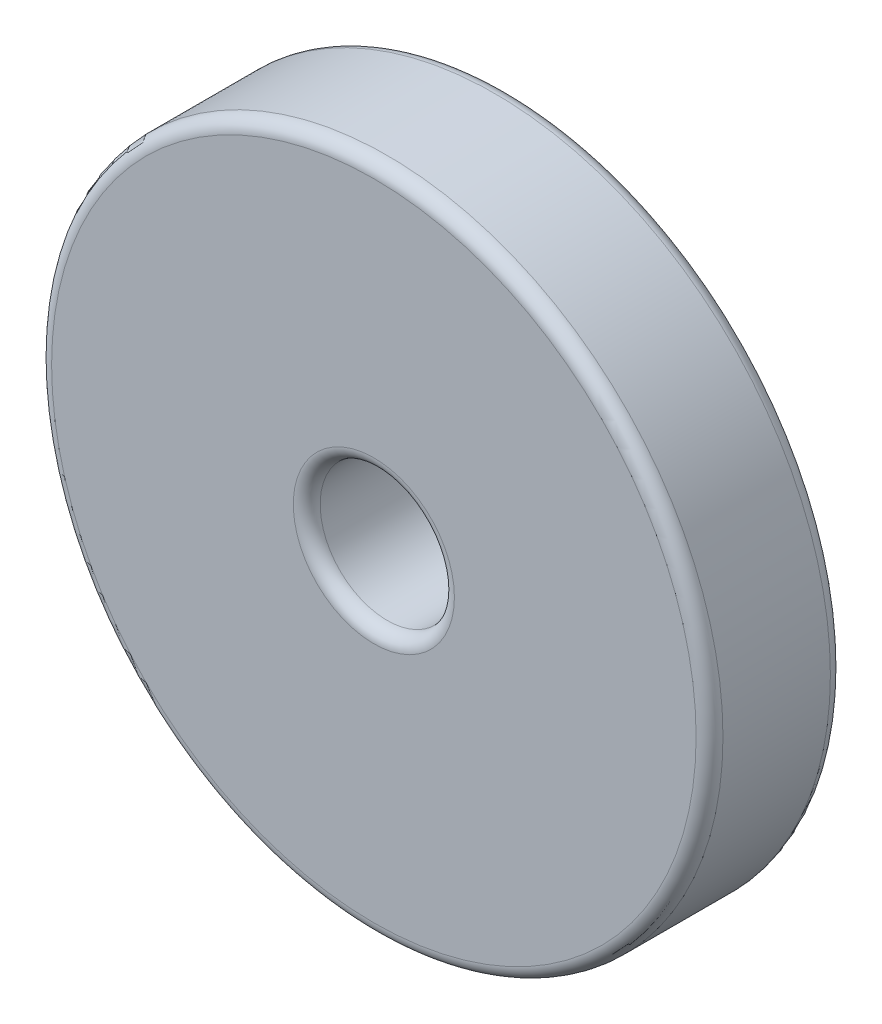
ISO-10303-21;
HEADER;
FILE_DESCRIPTION(('STEP AP214'),'2;1');
FILE_NAME('part.step','',(''),(''),'','','');
FILE_SCHEMA(('AUTOMOTIVE_DESIGN { 1 0 10303 214 1 1 1 1 }'));
ENDSEC;
DATA;
#1=APPLICATION_CONTEXT('core data for automotive mechanical design processes');
#2=APPLICATION_PROTOCOL_DEFINITION('international standard','automotive_design',2000,#1);
#3=PRODUCT_CONTEXT('',#1,'mechanical');
#4=PRODUCT('Part','Part','',(#3));
#5=PRODUCT_RELATED_PRODUCT_CATEGORY('part','',(#4));
#6=PRODUCT_DEFINITION_FORMATION('','',#4);
#7=PRODUCT_DEFINITION_CONTEXT('part definition',#1,'design');
#8=PRODUCT_DEFINITION('design','',#6,#7);
#9=PRODUCT_DEFINITION_SHAPE('','',#8);
#10=(LENGTH_UNIT() NAMED_UNIT(*) SI_UNIT(.MILLI.,.METRE.));
#11=(NAMED_UNIT(*) PLANE_ANGLE_UNIT() SI_UNIT($,.RADIAN.));
#12=(NAMED_UNIT(*) SI_UNIT($,.STERADIAN.) SOLID_ANGLE_UNIT());
#13=UNCERTAINTY_MEASURE_WITH_UNIT(LENGTH_MEASURE(1.E-05),#10,'distance_accuracy_value','');
#14=(GEOMETRIC_REPRESENTATION_CONTEXT(3) GLOBAL_UNCERTAINTY_ASSIGNED_CONTEXT((#13)) GLOBAL_UNIT_ASSIGNED_CONTEXT((#10,
#11,#12)) REPRESENTATION_CONTEXT('',''));
#15=CARTESIAN_POINT('',(0.,0.,0.));
#16=DIRECTION('',(0.,0.,1.));
#17=DIRECTION('',(1.,0.,0.));
#18=AXIS2_PLACEMENT_3D('',#15,#16,#17);
#19=CARTESIAN_POINT('',(0.,0.,10.));
#20=DIRECTION('',(0.,0.,1.));
#21=DIRECTION('',(1.,0.,0.));
#22=AXIS2_PLACEMENT_3D('',#19,#20,#21);
#23=PLANE('',#22);
#24=CARTESIAN_POINT('',(0.,0.,10.));
#25=DIRECTION('',(0.,0.,1.));
#26=DIRECTION('',(1.,0.,0.));
#27=AXIS2_PLACEMENT_3D('',#24,#25,#26);
#28=CIRCLE('',#27,24.);
#29=CARTESIAN_POINT('',(24.,0.,10.));
#30=VERTEX_POINT('',#29);
#31=EDGE_CURVE('E45',#30,#30,#28,.T.);
#32=ORIENTED_EDGE('',*,*,#31,.T.);
#33=EDGE_LOOP('',(#32));
#34=FACE_BOUND('',#33,.T.);
#35=CARTESIAN_POINT('',(0.,0.,10.));
#36=DIRECTION('',(0.,0.,1.));
#37=DIRECTION('',(1.,0.,0.));
#38=AXIS2_PLACEMENT_3D('',#35,#36,#37);
#39=CIRCLE('',#38,6.);
#40=CARTESIAN_POINT('',(6.,0.,10.));
#41=VERTEX_POINT('',#40);
#42=EDGE_CURVE('E65',#41,#41,#39,.F.);
#43=ORIENTED_EDGE('',*,*,#42,.T.);
#44=EDGE_LOOP('',(#43));
#45=FACE_BOUND('',#44,.T.);
#46=ADVANCED_FACE('F37',(#34,#45),#23,.T.);
#47=CARTESIAN_POINT('',(0.,0.,0.));
#48=DIRECTION('',(0.,0.,1.));
#49=DIRECTION('',(1.,0.,0.));
#50=AXIS2_PLACEMENT_3D('',#47,#48,#49);
#51=PLANE('',#50);
#52=CARTESIAN_POINT('',(0.,0.,0.));
#53=DIRECTION('',(0.,0.,1.));
#54=DIRECTION('',(1.,0.,0.));
#55=AXIS2_PLACEMENT_3D('',#52,#53,#54);
#56=CIRCLE('',#55,24.);
#57=CARTESIAN_POINT('',(24.,0.,0.));
#58=VERTEX_POINT('',#57);
#59=EDGE_CURVE('E50',#58,#58,#56,.F.);
#60=ORIENTED_EDGE('',*,*,#59,.T.);
#61=EDGE_LOOP('',(#60));
#62=FACE_BOUND('',#61,.T.);
#63=CARTESIAN_POINT('',(0.,0.,0.));
#64=DIRECTION('',(0.,0.,1.));
#65=DIRECTION('',(1.,0.,0.));
#66=AXIS2_PLACEMENT_3D('',#63,#64,#65);
#67=CIRCLE('',#66,6.);
#68=CARTESIAN_POINT('',(6.,0.,0.));
#69=VERTEX_POINT('',#68);
#70=EDGE_CURVE('E55',#69,#69,#67,.T.);
#71=ORIENTED_EDGE('',*,*,#70,.T.);
#72=EDGE_LOOP('',(#71));
#73=FACE_BOUND('',#72,.T.);
#74=ADVANCED_FACE('F86',(#62,#73),#51,.F.);
#75=CARTESIAN_POINT('',(0.,0.,10.));
#76=DIRECTION('',(0.,0.,-1.));
#77=DIRECTION('',(-1.,0.,0.));
#78=AXIS2_PLACEMENT_3D('',#75,#76,#77);
#79=CYLINDRICAL_SURFACE('',#78,25.);
#80=CARTESIAN_POINT('',(0.,0.,9.));
#81=DIRECTION('',(0.,0.,1.));
#82=DIRECTION('',(1.,0.,0.));
#83=AXIS2_PLACEMENT_3D('',#80,#81,#82);
#84=CIRCLE('',#83,25.);
#85=CARTESIAN_POINT('',(25.,0.,9.));
#86=VERTEX_POINT('',#85);
#87=EDGE_CURVE('E10',#86,#86,#84,.F.);
#88=ORIENTED_EDGE('',*,*,#87,.T.);
#89=EDGE_LOOP('',(#88));
#90=FACE_BOUND('',#89,.T.);
#91=CARTESIAN_POINT('',(0.,0.,0.999999999999999));
#92=DIRECTION('',(0.,0.,1.));
#93=DIRECTION('',(1.,0.,0.));
#94=AXIS2_PLACEMENT_3D('',#91,#92,#93);
#95=CIRCLE('',#94,25.);
#96=CARTESIAN_POINT('',(25.,0.,0.999999999999999));
#97=VERTEX_POINT('',#96);
#98=EDGE_CURVE('E61',#97,#97,#95,.T.);
#99=ORIENTED_EDGE('',*,*,#98,.T.);
#100=EDGE_LOOP('',(#99));
#101=FACE_BOUND('',#100,.T.);
#102=ADVANCED_FACE('F88',(#90,#101),#79,.T.);
#103=CARTESIAN_POINT('',(0.,0.,10.));
#104=DIRECTION('',(0.,0.,-1.));
#105=DIRECTION('',(-1.,0.,0.));
#106=AXIS2_PLACEMENT_3D('',#103,#104,#105);
#107=CYLINDRICAL_SURFACE('',#106,5.);
#108=CARTESIAN_POINT('',(0.,0.,9.));
#109=DIRECTION('',(0.,0.,1.));
#110=DIRECTION('',(1.,0.,0.));
#111=AXIS2_PLACEMENT_3D('',#108,#109,#110);
#112=CIRCLE('',#111,5.);
#113=CARTESIAN_POINT('',(5.,0.,9.));
#114=VERTEX_POINT('',#113);
#115=EDGE_CURVE('E69',#114,#114,#112,.T.);
#116=ORIENTED_EDGE('',*,*,#115,.T.);
#117=EDGE_LOOP('',(#116));
#118=FACE_BOUND('',#117,.T.);
#119=CARTESIAN_POINT('',(0.,0.,0.999999999999999));
#120=DIRECTION('',(0.,0.,1.));
#121=DIRECTION('',(1.,0.,0.));
#122=AXIS2_PLACEMENT_3D('',#119,#120,#121);
#123=CIRCLE('',#122,5.);
#124=CARTESIAN_POINT('',(5.,0.,0.999999999999999));
#125=VERTEX_POINT('',#124);
#126=EDGE_CURVE('E73',#125,#125,#123,.F.);
#127=ORIENTED_EDGE('',*,*,#126,.T.);
#128=EDGE_LOOP('',(#127));
#129=FACE_BOUND('',#128,.T.);
#130=ADVANCED_FACE('F78',(#118,#129),#107,.F.);
#131=CARTESIAN_POINT('',(0.,0.,9.));
#132=DIRECTION('',(0.,0.,1.));
#133=DIRECTION('',(1.,0.,0.));
#134=AXIS2_PLACEMENT_3D('',#131,#132,#133);
#135=TOROIDAL_SURFACE('',#134,6.,1.);
#136=ORIENTED_EDGE('',*,*,#42,.F.);
#137=EDGE_LOOP('',(#136));
#138=FACE_BOUND('',#137,.T.);
#139=ORIENTED_EDGE('',*,*,#115,.F.);
#140=EDGE_LOOP('',(#139));
#141=FACE_BOUND('',#140,.T.);
#142=ADVANCED_FACE('F99',(#138,#141),#135,.T.);
#143=CARTESIAN_POINT('',(0.,0.,0.999999999999999));
#144=DIRECTION('',(0.,0.,1.));
#145=DIRECTION('',(1.,0.,0.));
#146=AXIS2_PLACEMENT_3D('',#143,#144,#145);
#147=TOROIDAL_SURFACE('',#146,24.,1.);
#148=ORIENTED_EDGE('',*,*,#59,.F.);
#149=EDGE_LOOP('',(#148));
#150=FACE_BOUND('',#149,.T.);
#151=ORIENTED_EDGE('',*,*,#98,.F.);
#152=EDGE_LOOP('',(#151));
#153=FACE_BOUND('',#152,.T.);
#154=ADVANCED_FACE('F83',(#150,#153),#147,.T.);
#155=CARTESIAN_POINT('',(0.,0.,0.999999999999999));
#156=DIRECTION('',(0.,0.,1.));
#157=DIRECTION('',(1.,0.,0.));
#158=AXIS2_PLACEMENT_3D('',#155,#156,#157);
#159=TOROIDAL_SURFACE('',#158,6.,1.);
#160=ORIENTED_EDGE('',*,*,#126,.F.);
#161=EDGE_LOOP('',(#160));
#162=FACE_BOUND('',#161,.T.);
#163=ORIENTED_EDGE('',*,*,#70,.F.);
#164=EDGE_LOOP('',(#163));
#165=FACE_BOUND('',#164,.T.);
#166=ADVANCED_FACE('F80',(#162,#165),#159,.T.);
#167=CARTESIAN_POINT('',(0.,0.,9.));
#168=DIRECTION('',(0.,0.,1.));
#169=DIRECTION('',(1.,0.,0.));
#170=AXIS2_PLACEMENT_3D('',#167,#168,#169);
#171=TOROIDAL_SURFACE('',#170,24.,1.);
#172=ORIENTED_EDGE('',*,*,#87,.F.);
#173=EDGE_LOOP('',(#172));
#174=FACE_BOUND('',#173,.T.);
#175=ORIENTED_EDGE('',*,*,#31,.F.);
#176=EDGE_LOOP('',(#175));
#177=FACE_BOUND('',#176,.T.);
#178=ADVANCED_FACE('F39',(#174,#177),#171,.T.);
#179=CLOSED_SHELL('',(#46,#74,#102,#130,#142,#154,#166,#178));
#180=MANIFOLD_SOLID_BREP('B2',#179);
#181=ADVANCED_BREP_SHAPE_REPRESENTATION('',(#18,#180),#14);
#182=SHAPE_DEFINITION_REPRESENTATION(#9,#181);
ENDSEC;
END-ISO-10303-21;
